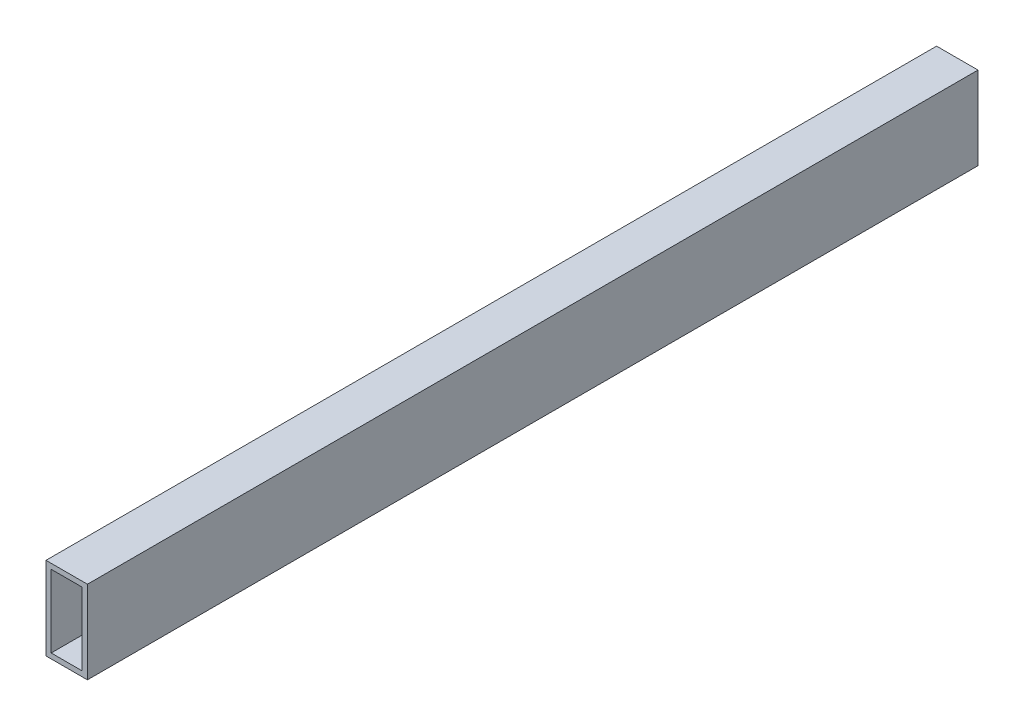
ISO-10303-21;
HEADER;
FILE_DESCRIPTION(('STEP AP214'),'2;1');
FILE_NAME('part.step','',(''),(''),'','','');
FILE_SCHEMA(('AUTOMOTIVE_DESIGN { 1 0 10303 214 1 1 1 1 }'));
ENDSEC;
DATA;
#1=APPLICATION_CONTEXT('core data for automotive mechanical design processes');
#2=APPLICATION_PROTOCOL_DEFINITION('international standard','automotive_design',2000,#1);
#3=PRODUCT_CONTEXT('',#1,'mechanical');
#4=PRODUCT('Part','Part','',(#3));
#5=PRODUCT_RELATED_PRODUCT_CATEGORY('part','',(#4));
#6=PRODUCT_DEFINITION_FORMATION('','',#4);
#7=PRODUCT_DEFINITION_CONTEXT('part definition',#1,'design');
#8=PRODUCT_DEFINITION('design','',#6,#7);
#9=PRODUCT_DEFINITION_SHAPE('','',#8);
#10=(LENGTH_UNIT() NAMED_UNIT(*) SI_UNIT(.MILLI.,.METRE.));
#11=(NAMED_UNIT(*) PLANE_ANGLE_UNIT() SI_UNIT($,.RADIAN.));
#12=(NAMED_UNIT(*) SI_UNIT($,.STERADIAN.) SOLID_ANGLE_UNIT());
#13=UNCERTAINTY_MEASURE_WITH_UNIT(LENGTH_MEASURE(1.E-05),#10,'distance_accuracy_value','');
#14=(GEOMETRIC_REPRESENTATION_CONTEXT(3) GLOBAL_UNCERTAINTY_ASSIGNED_CONTEXT((#13)) GLOBAL_UNIT_ASSIGNED_CONTEXT((#10,
#11,#12)) REPRESENTATION_CONTEXT('',''));
#15=CARTESIAN_POINT('',(0.,0.,0.));
#16=DIRECTION('',(0.,0.,1.));
#17=DIRECTION('',(1.,0.,0.));
#18=AXIS2_PLACEMENT_3D('',#15,#16,#17);
#19=CARTESIAN_POINT('',(0.,0.,546.1));
#20=DIRECTION('',(0.,0.,1.));
#21=DIRECTION('',(1.,0.,0.));
#22=AXIS2_PLACEMENT_3D('',#19,#20,#21);
#23=PLANE('',#22);
#24=DIRECTION('',(0.,1.,0.));
#25=VECTOR('',#24,1.);
#26=CARTESIAN_POINT('',(12.7,25.4,546.1));
#27=LINE('',#26,#25);
#28=CARTESIAN_POINT('',(12.7,-25.4,546.1));
#29=VERTEX_POINT('',#28);
#30=CARTESIAN_POINT('',(12.7,25.4,546.1));
#31=VERTEX_POINT('',#30);
#32=EDGE_CURVE('E140',#29,#31,#27,.T.);
#33=ORIENTED_EDGE('',*,*,#32,.T.);
#34=DIRECTION('',(-1.,0.,0.));
#35=VECTOR('',#34,1.);
#36=CARTESIAN_POINT('',(-12.7,25.4,546.1));
#37=LINE('',#36,#35);
#38=CARTESIAN_POINT('',(-12.7,25.4,546.1));
#39=VERTEX_POINT('',#38);
#40=EDGE_CURVE('E143',#31,#39,#37,.T.);
#41=ORIENTED_EDGE('',*,*,#40,.T.);
#42=DIRECTION('',(0.,-1.,0.));
#43=VECTOR('',#42,1.);
#44=CARTESIAN_POINT('',(-12.7,25.4,546.1));
#45=LINE('',#44,#43);
#46=CARTESIAN_POINT('',(-12.7,-25.4,546.1));
#47=VERTEX_POINT('',#46);
#48=EDGE_CURVE('E146',#39,#47,#45,.T.);
#49=ORIENTED_EDGE('',*,*,#48,.T.);
#50=DIRECTION('',(1.,0.,0.));
#51=VECTOR('',#50,1.);
#52=CARTESIAN_POINT('',(-12.7,-25.4,546.1));
#53=LINE('',#52,#51);
#54=EDGE_CURVE('E148',#47,#29,#53,.T.);
#55=ORIENTED_EDGE('',*,*,#54,.T.);
#56=EDGE_LOOP('',(#33,#41,#49,#55));
#57=FACE_BOUND('',#56,.T.);
#58=DIRECTION('',(-1.,0.,0.));
#59=VECTOR('',#58,1.);
#60=CARTESIAN_POINT('',(-9.525,22.225,546.1));
#61=LINE('',#60,#59);
#62=CARTESIAN_POINT('',(9.525,22.225,546.1));
#63=VERTEX_POINT('',#62);
#64=CARTESIAN_POINT('',(-9.525,22.225,546.1));
#65=VERTEX_POINT('',#64);
#66=EDGE_CURVE('E112',#63,#65,#61,.T.);
#67=ORIENTED_EDGE('',*,*,#66,.F.);
#68=DIRECTION('',(0.,1.,0.));
#69=VECTOR('',#68,1.);
#70=CARTESIAN_POINT('',(9.525,22.225,546.1));
#71=LINE('',#70,#69);
#72=CARTESIAN_POINT('',(9.525,-22.225,546.1));
#73=VERTEX_POINT('',#72);
#74=EDGE_CURVE('E104',#73,#63,#71,.T.);
#75=ORIENTED_EDGE('',*,*,#74,.F.);
#76=DIRECTION('',(1.,0.,0.));
#77=VECTOR('',#76,1.);
#78=CARTESIAN_POINT('',(-9.525,-22.225,546.1));
#79=LINE('',#78,#77);
#80=CARTESIAN_POINT('',(-9.525,-22.225,546.1));
#81=VERTEX_POINT('',#80);
#82=EDGE_CURVE('E126',#81,#73,#79,.T.);
#83=ORIENTED_EDGE('',*,*,#82,.F.);
#84=DIRECTION('',(0.,-1.,0.));
#85=VECTOR('',#84,1.);
#86=CARTESIAN_POINT('',(-9.525,22.225,546.1));
#87=LINE('',#86,#85);
#88=EDGE_CURVE('E124',#65,#81,#87,.T.);
#89=ORIENTED_EDGE('',*,*,#88,.F.);
#90=EDGE_LOOP('',(#67,#75,#83,#89));
#91=FACE_BOUND('',#90,.T.);
#92=ADVANCED_FACE('F39',(#57,#91),#23,.T.);
#93=CARTESIAN_POINT('',(0.,0.,0.));
#94=DIRECTION('',(0.,0.,1.));
#95=DIRECTION('',(1.,0.,0.));
#96=AXIS2_PLACEMENT_3D('',#93,#94,#95);
#97=PLANE('',#96);
#98=DIRECTION('',(0.,1.,0.));
#99=VECTOR('',#98,1.);
#100=CARTESIAN_POINT('',(12.7,25.4,0.));
#101=LINE('',#100,#99);
#102=CARTESIAN_POINT('',(12.7,-25.4,0.));
#103=VERTEX_POINT('',#102);
#104=CARTESIAN_POINT('',(12.7,25.4,0.));
#105=VERTEX_POINT('',#104);
#106=EDGE_CURVE('E120',#103,#105,#101,.T.);
#107=ORIENTED_EDGE('',*,*,#106,.F.);
#108=DIRECTION('',(1.,0.,0.));
#109=VECTOR('',#108,1.);
#110=CARTESIAN_POINT('',(-12.7,-25.4,0.));
#111=LINE('',#110,#109);
#112=CARTESIAN_POINT('',(-12.7,-25.4,0.));
#113=VERTEX_POINT('',#112);
#114=EDGE_CURVE('E144',#113,#103,#111,.T.);
#115=ORIENTED_EDGE('',*,*,#114,.F.);
#116=DIRECTION('',(0.,-1.,0.));
#117=VECTOR('',#116,1.);
#118=CARTESIAN_POINT('',(-12.7,25.4,0.));
#119=LINE('',#118,#117);
#120=CARTESIAN_POINT('',(-12.7,25.4,0.));
#121=VERTEX_POINT('',#120);
#122=EDGE_CURVE('E155',#121,#113,#119,.T.);
#123=ORIENTED_EDGE('',*,*,#122,.F.);
#124=DIRECTION('',(-1.,0.,0.));
#125=VECTOR('',#124,1.);
#126=CARTESIAN_POINT('',(-12.7,25.4,0.));
#127=LINE('',#126,#125);
#128=EDGE_CURVE('E153',#105,#121,#127,.T.);
#129=ORIENTED_EDGE('',*,*,#128,.F.);
#130=EDGE_LOOP('',(#107,#115,#123,#129));
#131=FACE_BOUND('',#130,.T.);
#132=DIRECTION('',(0.,1.,0.));
#133=VECTOR('',#132,1.);
#134=CARTESIAN_POINT('',(9.525,22.225,0.));
#135=LINE('',#134,#133);
#136=CARTESIAN_POINT('',(9.525,-22.225,0.));
#137=VERTEX_POINT('',#136);
#138=CARTESIAN_POINT('',(9.525,22.225,0.));
#139=VERTEX_POINT('',#138);
#140=EDGE_CURVE('E62',#137,#139,#135,.T.);
#141=ORIENTED_EDGE('',*,*,#140,.T.);
#142=DIRECTION('',(-1.,0.,0.));
#143=VECTOR('',#142,1.);
#144=CARTESIAN_POINT('',(-9.525,22.225,0.));
#145=LINE('',#144,#143);
#146=CARTESIAN_POINT('',(-9.525,22.225,0.));
#147=VERTEX_POINT('',#146);
#148=EDGE_CURVE('E119',#139,#147,#145,.T.);
#149=ORIENTED_EDGE('',*,*,#148,.T.);
#150=DIRECTION('',(0.,-1.,0.));
#151=VECTOR('',#150,1.);
#152=CARTESIAN_POINT('',(-9.525,22.225,0.));
#153=LINE('',#152,#151);
#154=CARTESIAN_POINT('',(-9.525,-22.225,0.));
#155=VERTEX_POINT('',#154);
#156=EDGE_CURVE('E132',#147,#155,#153,.T.);
#157=ORIENTED_EDGE('',*,*,#156,.T.);
#158=DIRECTION('',(1.,0.,0.));
#159=VECTOR('',#158,1.);
#160=CARTESIAN_POINT('',(-9.525,-22.225,0.));
#161=LINE('',#160,#159);
#162=EDGE_CURVE('E113',#155,#137,#161,.T.);
#163=ORIENTED_EDGE('',*,*,#162,.T.);
#164=EDGE_LOOP('',(#141,#149,#157,#163));
#165=FACE_BOUND('',#164,.T.);
#166=ADVANCED_FACE('F173',(#131,#165),#97,.F.);
#167=CARTESIAN_POINT('',(12.7,25.4,546.1));
#168=DIRECTION('',(-1.,0.,0.));
#169=DIRECTION('',(0.,-1.,0.));
#170=AXIS2_PLACEMENT_3D('',#167,#168,#169);
#171=PLANE('',#170);
#172=ORIENTED_EDGE('',*,*,#106,.T.);
#173=DIRECTION('',(0.,0.,-1.));
#174=VECTOR('',#173,1.);
#175=CARTESIAN_POINT('',(12.7,25.4,546.1));
#176=LINE('',#175,#174);
#177=EDGE_CURVE('E11',#31,#105,#176,.T.);
#178=ORIENTED_EDGE('',*,*,#177,.F.);
#179=ORIENTED_EDGE('',*,*,#32,.F.);
#180=DIRECTION('',(0.,0.,-1.));
#181=VECTOR('',#180,1.);
#182=CARTESIAN_POINT('',(12.7,-25.4,546.1));
#183=LINE('',#182,#181);
#184=EDGE_CURVE('E150',#29,#103,#183,.T.);
#185=ORIENTED_EDGE('',*,*,#184,.T.);
#186=EDGE_LOOP('',(#172,#178,#179,#185));
#187=FACE_BOUND('',#186,.T.);
#188=ADVANCED_FACE('F41',(#187),#171,.F.);
#189=CARTESIAN_POINT('',(-12.7,25.4,546.1));
#190=DIRECTION('',(0.,-1.,0.));
#191=DIRECTION('',(0.,0.,-1.));
#192=AXIS2_PLACEMENT_3D('',#189,#190,#191);
#193=PLANE('',#192);
#194=ORIENTED_EDGE('',*,*,#128,.T.);
#195=DIRECTION('',(0.,0.,-1.));
#196=VECTOR('',#195,1.);
#197=CARTESIAN_POINT('',(-12.7,25.4,546.1));
#198=LINE('',#197,#196);
#199=EDGE_CURVE('E47',#39,#121,#198,.T.);
#200=ORIENTED_EDGE('',*,*,#199,.F.);
#201=ORIENTED_EDGE('',*,*,#40,.F.);
#202=ORIENTED_EDGE('',*,*,#177,.T.);
#203=EDGE_LOOP('',(#194,#200,#201,#202));
#204=FACE_BOUND('',#203,.T.);
#205=ADVANCED_FACE('F183',(#204),#193,.F.);
#206=CARTESIAN_POINT('',(-12.7,25.4,546.1));
#207=DIRECTION('',(1.,0.,0.));
#208=DIRECTION('',(0.,1.,0.));
#209=AXIS2_PLACEMENT_3D('',#206,#207,#208);
#210=PLANE('',#209);
#211=ORIENTED_EDGE('',*,*,#122,.T.);
#212=DIRECTION('',(0.,0.,-1.));
#213=VECTOR('',#212,1.);
#214=CARTESIAN_POINT('',(-12.7,-25.4,546.1));
#215=LINE('',#214,#213);
#216=EDGE_CURVE('E160',#47,#113,#215,.T.);
#217=ORIENTED_EDGE('',*,*,#216,.F.);
#218=ORIENTED_EDGE('',*,*,#48,.F.);
#219=ORIENTED_EDGE('',*,*,#199,.T.);
#220=EDGE_LOOP('',(#211,#217,#218,#219));
#221=FACE_BOUND('',#220,.T.);
#222=ADVANCED_FACE('F167',(#221),#210,.F.);
#223=CARTESIAN_POINT('',(-12.7,-25.4,546.1));
#224=DIRECTION('',(0.,1.,0.));
#225=DIRECTION('',(-1.,0.,0.));
#226=AXIS2_PLACEMENT_3D('',#223,#224,#225);
#227=PLANE('',#226);
#228=ORIENTED_EDGE('',*,*,#114,.T.);
#229=ORIENTED_EDGE('',*,*,#184,.F.);
#230=ORIENTED_EDGE('',*,*,#54,.F.);
#231=ORIENTED_EDGE('',*,*,#216,.T.);
#232=EDGE_LOOP('',(#228,#229,#230,#231));
#233=FACE_BOUND('',#232,.T.);
#234=ADVANCED_FACE('F177',(#233),#227,.F.);
#235=CARTESIAN_POINT('',(9.525,22.225,546.1));
#236=DIRECTION('',(-1.,0.,0.));
#237=DIRECTION('',(0.,0.,1.));
#238=AXIS2_PLACEMENT_3D('',#235,#236,#237);
#239=PLANE('',#238);
#240=ORIENTED_EDGE('',*,*,#140,.F.);
#241=DIRECTION('',(0.,0.,-1.));
#242=VECTOR('',#241,1.);
#243=CARTESIAN_POINT('',(9.525,-22.225,546.1));
#244=LINE('',#243,#242);
#245=EDGE_CURVE('E108',#73,#137,#244,.T.);
#246=ORIENTED_EDGE('',*,*,#245,.F.);
#247=ORIENTED_EDGE('',*,*,#74,.T.);
#248=DIRECTION('',(0.,0.,-1.));
#249=VECTOR('',#248,1.);
#250=CARTESIAN_POINT('',(9.525,22.225,546.1));
#251=LINE('',#250,#249);
#252=EDGE_CURVE('E107',#63,#139,#251,.T.);
#253=ORIENTED_EDGE('',*,*,#252,.T.);
#254=EDGE_LOOP('',(#240,#246,#247,#253));
#255=FACE_BOUND('',#254,.T.);
#256=ADVANCED_FACE('F106',(#255),#239,.T.);
#257=CARTESIAN_POINT('',(-9.525,22.225,546.1));
#258=DIRECTION('',(0.,-1.,0.));
#259=DIRECTION('',(1.,0.,0.));
#260=AXIS2_PLACEMENT_3D('',#257,#258,#259);
#261=PLANE('',#260);
#262=ORIENTED_EDGE('',*,*,#148,.F.);
#263=ORIENTED_EDGE('',*,*,#252,.F.);
#264=ORIENTED_EDGE('',*,*,#66,.T.);
#265=DIRECTION('',(0.,0.,-1.));
#266=VECTOR('',#265,1.);
#267=CARTESIAN_POINT('',(-9.525,22.225,546.1));
#268=LINE('',#267,#266);
#269=EDGE_CURVE('E121',#65,#147,#268,.T.);
#270=ORIENTED_EDGE('',*,*,#269,.T.);
#271=EDGE_LOOP('',(#262,#263,#264,#270));
#272=FACE_BOUND('',#271,.T.);
#273=ADVANCED_FACE('F116',(#272),#261,.T.);
#274=CARTESIAN_POINT('',(-9.525,22.225,546.1));
#275=DIRECTION('',(1.,0.,0.));
#276=DIRECTION('',(0.,1.,0.));
#277=AXIS2_PLACEMENT_3D('',#274,#275,#276);
#278=PLANE('',#277);
#279=ORIENTED_EDGE('',*,*,#156,.F.);
#280=ORIENTED_EDGE('',*,*,#269,.F.);
#281=ORIENTED_EDGE('',*,*,#88,.T.);
#282=DIRECTION('',(0.,0.,-1.));
#283=VECTOR('',#282,1.);
#284=CARTESIAN_POINT('',(-9.525,-22.225,546.1));
#285=LINE('',#284,#283);
#286=EDGE_CURVE('E54',#81,#155,#285,.T.);
#287=ORIENTED_EDGE('',*,*,#286,.T.);
#288=EDGE_LOOP('',(#279,#280,#281,#287));
#289=FACE_BOUND('',#288,.T.);
#290=ADVANCED_FACE('F206',(#289),#278,.T.);
#291=CARTESIAN_POINT('',(-9.525,-22.225,546.1));
#292=DIRECTION('',(0.,1.,0.));
#293=DIRECTION('',(0.,0.,1.));
#294=AXIS2_PLACEMENT_3D('',#291,#292,#293);
#295=PLANE('',#294);
#296=ORIENTED_EDGE('',*,*,#162,.F.);
#297=ORIENTED_EDGE('',*,*,#286,.F.);
#298=ORIENTED_EDGE('',*,*,#82,.T.);
#299=ORIENTED_EDGE('',*,*,#245,.T.);
#300=EDGE_LOOP('',(#296,#297,#298,#299));
#301=FACE_BOUND('',#300,.T.);
#302=ADVANCED_FACE('F210',(#301),#295,.T.);
#303=CLOSED_SHELL('',(#92,#166,#188,#205,#222,#234,#256,#273,#290,#302));
#304=MANIFOLD_SOLID_BREP('B2',#303);
#305=ADVANCED_BREP_SHAPE_REPRESENTATION('',(#18,#304),#14);
#306=SHAPE_DEFINITION_REPRESENTATION(#9,#305);
ENDSEC;
END-ISO-10303-21;
